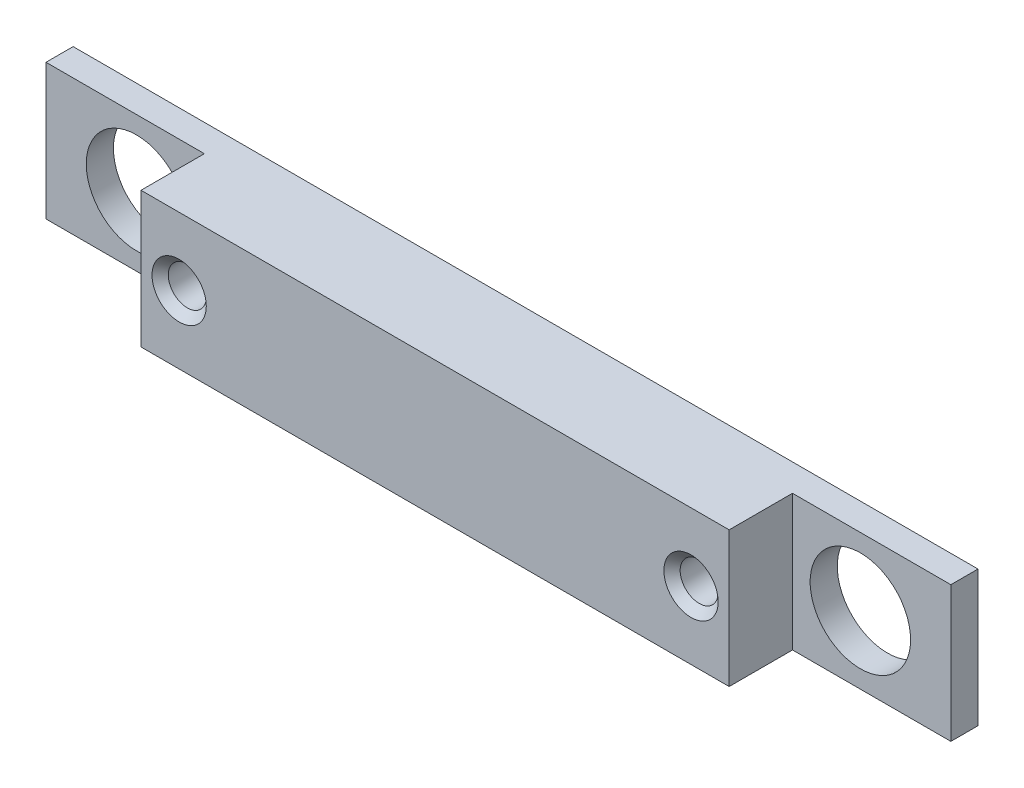
ISO-10303-21;
HEADER;
FILE_DESCRIPTION(('STEP AP214'),'2;1');
FILE_NAME('part.step','',(''),(''),'','','');
FILE_SCHEMA(('AUTOMOTIVE_DESIGN { 1 0 10303 214 1 1 1 1 }'));
ENDSEC;
DATA;
#1=APPLICATION_CONTEXT('core data for automotive mechanical design processes');
#2=APPLICATION_PROTOCOL_DEFINITION('international standard','automotive_design',2000,#1);
#3=PRODUCT_CONTEXT('',#1,'mechanical');
#4=PRODUCT('Part','Part','',(#3));
#5=PRODUCT_RELATED_PRODUCT_CATEGORY('part','',(#4));
#6=PRODUCT_DEFINITION_FORMATION('','',#4);
#7=PRODUCT_DEFINITION_CONTEXT('part definition',#1,'design');
#8=PRODUCT_DEFINITION('design','',#6,#7);
#9=PRODUCT_DEFINITION_SHAPE('','',#8);
#10=(LENGTH_UNIT() NAMED_UNIT(*) SI_UNIT(.MILLI.,.METRE.));
#11=(NAMED_UNIT(*) PLANE_ANGLE_UNIT() SI_UNIT($,.RADIAN.));
#12=(NAMED_UNIT(*) SI_UNIT($,.STERADIAN.) SOLID_ANGLE_UNIT());
#13=UNCERTAINTY_MEASURE_WITH_UNIT(LENGTH_MEASURE(1.E-05),#10,'distance_accuracy_value','');
#14=(GEOMETRIC_REPRESENTATION_CONTEXT(3) GLOBAL_UNCERTAINTY_ASSIGNED_CONTEXT((#13)) GLOBAL_UNIT_ASSIGNED_CONTEXT((#10,
#11,#12)) REPRESENTATION_CONTEXT('',''));
#15=CARTESIAN_POINT('',(0.,0.,0.));
#16=DIRECTION('',(0.,0.,1.));
#17=DIRECTION('',(1.,0.,0.));
#18=AXIS2_PLACEMENT_3D('',#15,#16,#17);
#19=CARTESIAN_POINT('',(0.,0.,5.));
#20=DIRECTION('',(0.,0.,-1.));
#21=DIRECTION('',(-1.,0.,0.));
#22=AXIS2_PLACEMENT_3D('',#19,#20,#21);
#23=PLANE('',#22);
#24=CARTESIAN_POINT('',(-28.2845,0.,5.));
#25=DIRECTION('',(0.,0.,1.));
#26=DIRECTION('',(1.,0.,0.));
#27=AXIS2_PLACEMENT_3D('',#24,#25,#26);
#28=CIRCLE('',#27,3.);
#29=CARTESIAN_POINT('',(-25.2845,0.,5.));
#30=VERTEX_POINT('',#29);
#31=EDGE_CURVE('E159',#30,#30,#28,.T.);
#32=ORIENTED_EDGE('',*,*,#31,.F.);
#33=EDGE_LOOP('',(#32));
#34=FACE_BOUND('',#33,.T.);
#35=CARTESIAN_POINT('',(28.2845,0.,5.));
#36=DIRECTION('',(0.,0.,1.));
#37=DIRECTION('',(1.,0.,0.));
#38=AXIS2_PLACEMENT_3D('',#35,#36,#37);
#39=CIRCLE('',#38,3.);
#40=CARTESIAN_POINT('',(31.2845,0.,5.));
#41=VERTEX_POINT('',#40);
#42=EDGE_CURVE('E151',#41,#41,#39,.T.);
#43=ORIENTED_EDGE('',*,*,#42,.F.);
#44=EDGE_LOOP('',(#43));
#45=FACE_BOUND('',#44,.T.);
#46=DIRECTION('',(0.,-1.,0.));
#47=VECTOR('',#46,1.);
#48=CARTESIAN_POINT('',(32.5,7.5,5.));
#49=LINE('',#48,#47);
#50=CARTESIAN_POINT('',(32.5,7.5,5.));
#51=VERTEX_POINT('',#50);
#52=CARTESIAN_POINT('',(32.5,-7.5,5.));
#53=VERTEX_POINT('',#52);
#54=EDGE_CURVE('E105',#51,#53,#49,.T.);
#55=ORIENTED_EDGE('',*,*,#54,.F.);
#56=DIRECTION('',(-1.,0.,0.));
#57=VECTOR('',#56,1.);
#58=CARTESIAN_POINT('',(-50.,7.5,5.));
#59=LINE('',#58,#57);
#60=CARTESIAN_POINT('',(-32.5,7.5,5.));
#61=VERTEX_POINT('',#60);
#62=EDGE_CURVE('E124',#51,#61,#59,.T.);
#63=ORIENTED_EDGE('',*,*,#62,.T.);
#64=DIRECTION('',(0.,-1.,0.));
#65=VECTOR('',#64,1.);
#66=CARTESIAN_POINT('',(-32.5,7.5,5.));
#67=LINE('',#66,#65);
#68=CARTESIAN_POINT('',(-32.5,-7.5,5.));
#69=VERTEX_POINT('',#68);
#70=EDGE_CURVE('E122',#61,#69,#67,.T.);
#71=ORIENTED_EDGE('',*,*,#70,.T.);
#72=DIRECTION('',(1.,0.,0.));
#73=VECTOR('',#72,1.);
#74=CARTESIAN_POINT('',(-50.,-7.5,5.));
#75=LINE('',#74,#73);
#76=EDGE_CURVE('E118',#69,#53,#75,.T.);
#77=ORIENTED_EDGE('',*,*,#76,.T.);
#78=EDGE_LOOP('',(#55,#63,#71,#77));
#79=FACE_BOUND('',#78,.T.);
#80=ADVANCED_FACE('F39',(#34,#45,#79),#23,.F.);
#81=CARTESIAN_POINT('',(50.,-7.5,5.));
#82=DIRECTION('',(-1.,0.,0.));
#83=DIRECTION('',(0.,0.,1.));
#84=AXIS2_PLACEMENT_3D('',#81,#82,#83);
#85=PLANE('',#84);
#86=DIRECTION('',(0.,1.,0.));
#87=VECTOR('',#86,1.);
#88=CARTESIAN_POINT('',(50.,7.5,-2.));
#89=LINE('',#88,#87);
#90=CARTESIAN_POINT('',(50.,-7.5,-2.));
#91=VERTEX_POINT('',#90);
#92=CARTESIAN_POINT('',(50.,7.5,-2.));
#93=VERTEX_POINT('',#92);
#94=EDGE_CURVE('E241',#91,#93,#89,.T.);
#95=ORIENTED_EDGE('',*,*,#94,.F.);
#96=DIRECTION('',(0.,0.,-1.));
#97=VECTOR('',#96,1.);
#98=CARTESIAN_POINT('',(50.,-7.5,5.));
#99=LINE('',#98,#97);
#100=CARTESIAN_POINT('',(50.,-7.5,-5.));
#101=VERTEX_POINT('',#100);
#102=EDGE_CURVE('E123',#91,#101,#99,.T.);
#103=ORIENTED_EDGE('',*,*,#102,.T.);
#104=DIRECTION('',(0.,1.,0.));
#105=VECTOR('',#104,1.);
#106=CARTESIAN_POINT('',(50.,-7.5,-5.));
#107=LINE('',#106,#105);
#108=CARTESIAN_POINT('',(50.,7.5,-5.));
#109=VERTEX_POINT('',#108);
#110=EDGE_CURVE('E132',#101,#109,#107,.T.);
#111=ORIENTED_EDGE('',*,*,#110,.T.);
#112=DIRECTION('',(0.,0.,-1.));
#113=VECTOR('',#112,1.);
#114=CARTESIAN_POINT('',(50.,7.5,5.));
#115=LINE('',#114,#113);
#116=EDGE_CURVE('E11',#93,#109,#115,.T.);
#117=ORIENTED_EDGE('',*,*,#116,.F.);
#118=EDGE_LOOP('',(#95,#103,#111,#117));
#119=FACE_BOUND('',#118,.T.);
#120=ADVANCED_FACE('F41',(#119),#85,.F.);
#121=CARTESIAN_POINT('',(-50.,7.5,5.));
#122=DIRECTION('',(0.,-1.,0.));
#123=DIRECTION('',(0.,0.,-1.));
#124=AXIS2_PLACEMENT_3D('',#121,#122,#123);
#125=PLANE('',#124);
#126=DIRECTION('',(0.,0.,-1.));
#127=VECTOR('',#126,1.);
#128=CARTESIAN_POINT('',(32.5,7.5,5.));
#129=LINE('',#128,#127);
#130=CARTESIAN_POINT('',(32.5,7.5,-2.));
#131=VERTEX_POINT('',#130);
#132=EDGE_CURVE('E108',#51,#131,#129,.T.);
#133=ORIENTED_EDGE('',*,*,#132,.T.);
#134=DIRECTION('',(-1.,0.,0.));
#135=VECTOR('',#134,1.);
#136=CARTESIAN_POINT('',(50.,7.5,-2.));
#137=LINE('',#136,#135);
#138=EDGE_CURVE('E112',#93,#131,#137,.T.);
#139=ORIENTED_EDGE('',*,*,#138,.F.);
#140=ORIENTED_EDGE('',*,*,#116,.T.);
#141=DIRECTION('',(-1.,0.,0.));
#142=VECTOR('',#141,1.);
#143=CARTESIAN_POINT('',(-50.,7.5,-5.));
#144=LINE('',#143,#142);
#145=CARTESIAN_POINT('',(-50.,7.5,-5.));
#146=VERTEX_POINT('',#145);
#147=EDGE_CURVE('E135',#109,#146,#144,.T.);
#148=ORIENTED_EDGE('',*,*,#147,.T.);
#149=DIRECTION('',(0.,0.,-1.));
#150=VECTOR('',#149,1.);
#151=CARTESIAN_POINT('',(-50.,7.5,5.));
#152=LINE('',#151,#150);
#153=CARTESIAN_POINT('',(-50.,7.5,-2.));
#154=VERTEX_POINT('',#153);
#155=EDGE_CURVE('E48',#154,#146,#152,.T.);
#156=ORIENTED_EDGE('',*,*,#155,.F.);
#157=DIRECTION('',(1.,0.,0.));
#158=VECTOR('',#157,1.);
#159=CARTESIAN_POINT('',(-50.,7.5,-2.));
#160=LINE('',#159,#158);
#161=CARTESIAN_POINT('',(-32.5,7.5,-2.));
#162=VERTEX_POINT('',#161);
#163=EDGE_CURVE('E227',#154,#162,#160,.T.);
#164=ORIENTED_EDGE('',*,*,#163,.T.);
#165=DIRECTION('',(0.,0.,-1.));
#166=VECTOR('',#165,1.);
#167=CARTESIAN_POINT('',(-32.5,7.5,5.));
#168=LINE('',#167,#166);
#169=EDGE_CURVE('E161',#61,#162,#168,.T.);
#170=ORIENTED_EDGE('',*,*,#169,.F.);
#171=ORIENTED_EDGE('',*,*,#62,.F.);
#172=EDGE_LOOP('',(#133,#139,#140,#148,#156,#164,#170,#171));
#173=FACE_BOUND('',#172,.T.);
#174=ADVANCED_FACE('F192',(#173),#125,.F.);
#175=CARTESIAN_POINT('',(-50.,-7.5,5.));
#176=DIRECTION('',(0.,1.,0.));
#177=DIRECTION('',(0.,0.,1.));
#178=AXIS2_PLACEMENT_3D('',#175,#176,#177);
#179=PLANE('',#178);
#180=DIRECTION('',(0.,0.,-1.));
#181=VECTOR('',#180,1.);
#182=CARTESIAN_POINT('',(32.5,-7.5,5.));
#183=LINE('',#182,#181);
#184=CARTESIAN_POINT('',(32.5,-7.5,-2.));
#185=VERTEX_POINT('',#184);
#186=EDGE_CURVE('E56',#53,#185,#183,.T.);
#187=ORIENTED_EDGE('',*,*,#186,.F.);
#188=ORIENTED_EDGE('',*,*,#76,.F.);
#189=DIRECTION('',(0.,0.,-1.));
#190=VECTOR('',#189,1.);
#191=CARTESIAN_POINT('',(-32.5,-7.5,5.));
#192=LINE('',#191,#190);
#193=CARTESIAN_POINT('',(-32.5,-7.5,-2.));
#194=VERTEX_POINT('',#193);
#195=EDGE_CURVE('E64',#69,#194,#192,.T.);
#196=ORIENTED_EDGE('',*,*,#195,.T.);
#197=DIRECTION('',(-1.,0.,0.));
#198=VECTOR('',#197,1.);
#199=CARTESIAN_POINT('',(-50.,-7.5,-2.));
#200=LINE('',#199,#198);
#201=CARTESIAN_POINT('',(-50.,-7.5,-2.));
#202=VERTEX_POINT('',#201);
#203=EDGE_CURVE('E166',#194,#202,#200,.T.);
#204=ORIENTED_EDGE('',*,*,#203,.T.);
#205=DIRECTION('',(0.,0.,-1.));
#206=VECTOR('',#205,1.);
#207=CARTESIAN_POINT('',(-50.,-7.5,5.));
#208=LINE('',#207,#206);
#209=CARTESIAN_POINT('',(-50.,-7.5,-5.));
#210=VERTEX_POINT('',#209);
#211=EDGE_CURVE('E126',#202,#210,#208,.T.);
#212=ORIENTED_EDGE('',*,*,#211,.T.);
#213=DIRECTION('',(1.,0.,0.));
#214=VECTOR('',#213,1.);
#215=CARTESIAN_POINT('',(-50.,-7.5,-5.));
#216=LINE('',#215,#214);
#217=EDGE_CURVE('E128',#210,#101,#216,.T.);
#218=ORIENTED_EDGE('',*,*,#217,.T.);
#219=ORIENTED_EDGE('',*,*,#102,.F.);
#220=DIRECTION('',(1.,0.,0.));
#221=VECTOR('',#220,1.);
#222=CARTESIAN_POINT('',(50.,-7.5,-2.));
#223=LINE('',#222,#221);
#224=EDGE_CURVE('E120',#185,#91,#223,.T.);
#225=ORIENTED_EDGE('',*,*,#224,.F.);
#226=EDGE_LOOP('',(#187,#188,#196,#204,#212,#218,#219,#225));
#227=FACE_BOUND('',#226,.T.);
#228=ADVANCED_FACE('F117',(#227),#179,.F.);
#229=CARTESIAN_POINT('',(40.,0.,5.));
#230=DIRECTION('',(0.,0.,-1.));
#231=DIRECTION('',(-1.,0.,0.));
#232=AXIS2_PLACEMENT_3D('',#229,#230,#231);
#233=CYLINDRICAL_SURFACE('',#232,5.5499);
#234=CARTESIAN_POINT('',(40.,0.,-5.));
#235=DIRECTION('',(0.,0.,1.));
#236=DIRECTION('',(1.,0.,0.));
#237=AXIS2_PLACEMENT_3D('',#234,#235,#236);
#238=CIRCLE('',#237,5.5499);
#239=CARTESIAN_POINT('',(45.5499,0.,-5.));
#240=VERTEX_POINT('',#239);
#241=EDGE_CURVE('E217',#240,#240,#238,.T.);
#242=ORIENTED_EDGE('',*,*,#241,.F.);
#243=EDGE_LOOP('',(#242));
#244=FACE_BOUND('',#243,.T.);
#245=CARTESIAN_POINT('',(40.,0.,-2.));
#246=DIRECTION('',(0.,0.,1.));
#247=DIRECTION('',(1.,0.,0.));
#248=AXIS2_PLACEMENT_3D('',#245,#246,#247);
#249=CIRCLE('',#248,5.5499);
#250=CARTESIAN_POINT('',(45.5499,0.,-2.));
#251=VERTEX_POINT('',#250);
#252=EDGE_CURVE('E43',#251,#251,#249,.T.);
#253=ORIENTED_EDGE('',*,*,#252,.T.);
#254=EDGE_LOOP('',(#253));
#255=FACE_BOUND('',#254,.T.);
#256=ADVANCED_FACE('F201',(#244,#255),#233,.F.);
#257=CARTESIAN_POINT('',(0.,0.,-5.));
#258=DIRECTION('',(0.,0.,-1.));
#259=DIRECTION('',(-1.,0.,0.));
#260=AXIS2_PLACEMENT_3D('',#257,#258,#259);
#261=PLANE('',#260);
#262=ORIENTED_EDGE('',*,*,#110,.F.);
#263=ORIENTED_EDGE('',*,*,#217,.F.);
#264=DIRECTION('',(0.,-1.,0.));
#265=VECTOR('',#264,1.);
#266=CARTESIAN_POINT('',(-50.,-7.5,-5.));
#267=LINE('',#266,#265);
#268=EDGE_CURVE('E139',#146,#210,#267,.T.);
#269=ORIENTED_EDGE('',*,*,#268,.F.);
#270=ORIENTED_EDGE('',*,*,#147,.F.);
#271=EDGE_LOOP('',(#262,#263,#269,#270));
#272=FACE_BOUND('',#271,.T.);
#273=CARTESIAN_POINT('',(28.2845,0.,-5.));
#274=DIRECTION('',(0.,0.,-1.));
#275=DIRECTION('',(-1.,0.,0.));
#276=AXIS2_PLACEMENT_3D('',#273,#274,#275);
#277=CIRCLE('',#276,2.09999999999999);
#278=CARTESIAN_POINT('',(26.1845,0.,-5.));
#279=VERTEX_POINT('',#278);
#280=EDGE_CURVE('E136',#279,#279,#277,.T.);
#281=ORIENTED_EDGE('',*,*,#280,.F.);
#282=EDGE_LOOP('',(#281));
#283=FACE_BOUND('',#282,.T.);
#284=CARTESIAN_POINT('',(-28.2845,0.,-5.));
#285=DIRECTION('',(0.,0.,-1.));
#286=DIRECTION('',(-1.,0.,0.));
#287=AXIS2_PLACEMENT_3D('',#284,#285,#286);
#288=CIRCLE('',#287,2.09999999999999);
#289=CARTESIAN_POINT('',(-30.3845,0.,-5.));
#290=VERTEX_POINT('',#289);
#291=EDGE_CURVE('E149',#290,#290,#288,.T.);
#292=ORIENTED_EDGE('',*,*,#291,.F.);
#293=EDGE_LOOP('',(#292));
#294=FACE_BOUND('',#293,.T.);
#295=CARTESIAN_POINT('',(-40.,0.,-5.));
#296=DIRECTION('',(0.,0.,-1.));
#297=DIRECTION('',(-1.,0.,0.));
#298=AXIS2_PLACEMENT_3D('',#295,#296,#297);
#299=CIRCLE('',#298,5.5499);
#300=CARTESIAN_POINT('',(-45.5499,0.,-5.));
#301=VERTEX_POINT('',#300);
#302=EDGE_CURVE('E155',#301,#301,#299,.T.);
#303=ORIENTED_EDGE('',*,*,#302,.F.);
#304=EDGE_LOOP('',(#303));
#305=FACE_BOUND('',#304,.T.);
#306=ORIENTED_EDGE('',*,*,#241,.T.);
#307=EDGE_LOOP('',(#306));
#308=FACE_BOUND('',#307,.T.);
#309=ADVANCED_FACE('F197',(#272,#283,#294,#305,#308),#261,.T.);
#310=CARTESIAN_POINT('',(-50.,-7.5,5.));
#311=DIRECTION('',(1.,0.,0.));
#312=DIRECTION('',(0.,0.,-1.));
#313=AXIS2_PLACEMENT_3D('',#310,#311,#312);
#314=PLANE('',#313);
#315=DIRECTION('',(0.,1.,0.));
#316=VECTOR('',#315,1.);
#317=CARTESIAN_POINT('',(-50.,7.5,-2.));
#318=LINE('',#317,#316);
#319=EDGE_CURVE('E223',#202,#154,#318,.T.);
#320=ORIENTED_EDGE('',*,*,#319,.T.);
#321=ORIENTED_EDGE('',*,*,#155,.T.);
#322=ORIENTED_EDGE('',*,*,#268,.T.);
#323=ORIENTED_EDGE('',*,*,#211,.F.);
#324=EDGE_LOOP('',(#320,#321,#322,#323));
#325=FACE_BOUND('',#324,.T.);
#326=ADVANCED_FACE('F200',(#325),#314,.F.);
#327=CARTESIAN_POINT('',(-40.,0.,5.));
#328=DIRECTION('',(0.,0.,-1.));
#329=DIRECTION('',(-1.,0.,0.));
#330=AXIS2_PLACEMENT_3D('',#327,#328,#329);
#331=CYLINDRICAL_SURFACE('',#330,5.5499);
#332=ORIENTED_EDGE('',*,*,#302,.T.);
#333=EDGE_LOOP('',(#332));
#334=FACE_BOUND('',#333,.T.);
#335=CARTESIAN_POINT('',(-40.,0.,-2.));
#336=DIRECTION('',(0.,0.,1.));
#337=DIRECTION('',(1.,0.,0.));
#338=AXIS2_PLACEMENT_3D('',#335,#336,#337);
#339=CIRCLE('',#338,5.5499);
#340=CARTESIAN_POINT('',(-34.4501,0.,-2.));
#341=VERTEX_POINT('',#340);
#342=EDGE_CURVE('E153',#341,#341,#339,.F.);
#343=ORIENTED_EDGE('',*,*,#342,.F.);
#344=EDGE_LOOP('',(#343));
#345=FACE_BOUND('',#344,.T.);
#346=ADVANCED_FACE('F206',(#334,#345),#331,.F.);
#347=CARTESIAN_POINT('',(28.2845,0.,5.));
#348=DIRECTION('',(0.,0.,1.));
#349=DIRECTION('',(1.,0.,0.));
#350=AXIS2_PLACEMENT_3D('',#347,#348,#349);
#351=CYLINDRICAL_SURFACE('',#350,2.09999999999999);
#352=ORIENTED_EDGE('',*,*,#280,.T.);
#353=EDGE_LOOP('',(#352));
#354=FACE_BOUND('',#353,.T.);
#355=CARTESIAN_POINT('',(28.2845,0.,4.1));
#356=DIRECTION('',(0.,0.,1.));
#357=DIRECTION('',(1.,0.,0.));
#358=AXIS2_PLACEMENT_3D('',#355,#356,#357);
#359=CIRCLE('',#358,2.1);
#360=CARTESIAN_POINT('',(30.3845,0.,4.1));
#361=VERTEX_POINT('',#360);
#362=EDGE_CURVE('E148',#361,#361,#359,.T.);
#363=ORIENTED_EDGE('',*,*,#362,.T.);
#364=EDGE_LOOP('',(#363));
#365=FACE_BOUND('',#364,.T.);
#366=ADVANCED_FACE('F177',(#354,#365),#351,.F.);
#367=CARTESIAN_POINT('',(28.2845,0.,5.));
#368=DIRECTION('',(0.,0.,1.));
#369=DIRECTION('',(1.,0.,0.));
#370=AXIS2_PLACEMENT_3D('',#367,#368,#369);
#371=CONICAL_SURFACE('',#370,3.,0.785398163397449);
#372=ORIENTED_EDGE('',*,*,#362,.F.);
#373=EDGE_LOOP('',(#372));
#374=FACE_BOUND('',#373,.T.);
#375=ORIENTED_EDGE('',*,*,#42,.T.);
#376=EDGE_LOOP('',(#375));
#377=FACE_BOUND('',#376,.T.);
#378=ADVANCED_FACE('F179',(#374,#377),#371,.F.);
#379=CARTESIAN_POINT('',(-28.2845,0.,5.));
#380=DIRECTION('',(0.,0.,1.));
#381=DIRECTION('',(1.,0.,0.));
#382=AXIS2_PLACEMENT_3D('',#379,#380,#381);
#383=CYLINDRICAL_SURFACE('',#382,2.09999999999999);
#384=ORIENTED_EDGE('',*,*,#291,.T.);
#385=EDGE_LOOP('',(#384));
#386=FACE_BOUND('',#385,.T.);
#387=CARTESIAN_POINT('',(-28.2845,0.,4.1));
#388=DIRECTION('',(0.,0.,1.));
#389=DIRECTION('',(1.,0.,0.));
#390=AXIS2_PLACEMENT_3D('',#387,#388,#389);
#391=CIRCLE('',#390,2.1);
#392=CARTESIAN_POINT('',(-26.1845,0.,4.1));
#393=VERTEX_POINT('',#392);
#394=EDGE_CURVE('E152',#393,#393,#391,.T.);
#395=ORIENTED_EDGE('',*,*,#394,.T.);
#396=EDGE_LOOP('',(#395));
#397=FACE_BOUND('',#396,.T.);
#398=ADVANCED_FACE('F182',(#386,#397),#383,.F.);
#399=CARTESIAN_POINT('',(-28.2845,0.,5.));
#400=DIRECTION('',(0.,0.,1.));
#401=DIRECTION('',(1.,0.,0.));
#402=AXIS2_PLACEMENT_3D('',#399,#400,#401);
#403=CONICAL_SURFACE('',#402,3.,0.785398163397449);
#404=ORIENTED_EDGE('',*,*,#394,.F.);
#405=EDGE_LOOP('',(#404));
#406=FACE_BOUND('',#405,.T.);
#407=ORIENTED_EDGE('',*,*,#31,.T.);
#408=EDGE_LOOP('',(#407));
#409=FACE_BOUND('',#408,.T.);
#410=ADVANCED_FACE('F263',(#406,#409),#403,.F.);
#411=CARTESIAN_POINT('',(0.,0.,-2.));
#412=DIRECTION('',(0.,0.,1.));
#413=DIRECTION('',(1.,0.,0.));
#414=AXIS2_PLACEMENT_3D('',#411,#412,#413);
#415=PLANE('',#414);
#416=ORIENTED_EDGE('',*,*,#319,.F.);
#417=ORIENTED_EDGE('',*,*,#203,.F.);
#418=DIRECTION('',(0.,-1.,0.));
#419=VECTOR('',#418,1.);
#420=CARTESIAN_POINT('',(-32.5,7.5,-2.));
#421=LINE('',#420,#419);
#422=EDGE_CURVE('E229',#162,#194,#421,.T.);
#423=ORIENTED_EDGE('',*,*,#422,.F.);
#424=ORIENTED_EDGE('',*,*,#163,.F.);
#425=EDGE_LOOP('',(#416,#417,#423,#424));
#426=FACE_BOUND('',#425,.T.);
#427=ORIENTED_EDGE('',*,*,#342,.T.);
#428=EDGE_LOOP('',(#427));
#429=FACE_BOUND('',#428,.T.);
#430=ADVANCED_FACE('F260',(#426,#429),#415,.T.);
#431=CARTESIAN_POINT('',(-32.5,7.5,5.));
#432=DIRECTION('',(1.,0.,0.));
#433=DIRECTION('',(0.,0.,-1.));
#434=AXIS2_PLACEMENT_3D('',#431,#432,#433);
#435=PLANE('',#434);
#436=ORIENTED_EDGE('',*,*,#422,.T.);
#437=ORIENTED_EDGE('',*,*,#195,.F.);
#438=ORIENTED_EDGE('',*,*,#70,.F.);
#439=ORIENTED_EDGE('',*,*,#169,.T.);
#440=EDGE_LOOP('',(#436,#437,#438,#439));
#441=FACE_BOUND('',#440,.T.);
#442=ADVANCED_FACE('F253',(#441),#435,.F.);
#443=CARTESIAN_POINT('',(32.5,7.5,5.));
#444=DIRECTION('',(1.,0.,0.));
#445=DIRECTION('',(0.,0.,-1.));
#446=AXIS2_PLACEMENT_3D('',#443,#444,#445);
#447=PLANE('',#446);
#448=DIRECTION('',(0.,-1.,0.));
#449=VECTOR('',#448,1.);
#450=CARTESIAN_POINT('',(32.5,7.5,-2.));
#451=LINE('',#450,#449);
#452=EDGE_CURVE('E244',#131,#185,#451,.T.);
#453=ORIENTED_EDGE('',*,*,#452,.F.);
#454=ORIENTED_EDGE('',*,*,#132,.F.);
#455=ORIENTED_EDGE('',*,*,#54,.T.);
#456=ORIENTED_EDGE('',*,*,#186,.T.);
#457=EDGE_LOOP('',(#453,#454,#455,#456));
#458=FACE_BOUND('',#457,.T.);
#459=ADVANCED_FACE('F106',(#458),#447,.T.);
#460=CARTESIAN_POINT('',(0.,0.,-2.));
#461=DIRECTION('',(0.,0.,1.));
#462=DIRECTION('',(-1.,0.,0.));
#463=AXIS2_PLACEMENT_3D('',#460,#461,#462);
#464=PLANE('',#463);
#465=ORIENTED_EDGE('',*,*,#252,.F.);
#466=EDGE_LOOP('',(#465));
#467=FACE_BOUND('',#466,.T.);
#468=ORIENTED_EDGE('',*,*,#94,.T.);
#469=ORIENTED_EDGE('',*,*,#138,.T.);
#470=ORIENTED_EDGE('',*,*,#452,.T.);
#471=ORIENTED_EDGE('',*,*,#224,.T.);
#472=EDGE_LOOP('',(#468,#469,#470,#471));
#473=FACE_BOUND('',#472,.T.);
#474=ADVANCED_FACE('F246',(#467,#473),#464,.T.);
#475=CLOSED_SHELL('',(#80,#120,#174,#228,#256,#309,#326,#346,#366,#378,#398,#410,#430,#442,#459,#474));
#476=MANIFOLD_SOLID_BREP('B2',#475);
#477=ADVANCED_BREP_SHAPE_REPRESENTATION('',(#18,#476),#14);
#478=SHAPE_DEFINITION_REPRESENTATION(#9,#477);
ENDSEC;
END-ISO-10303-21;
